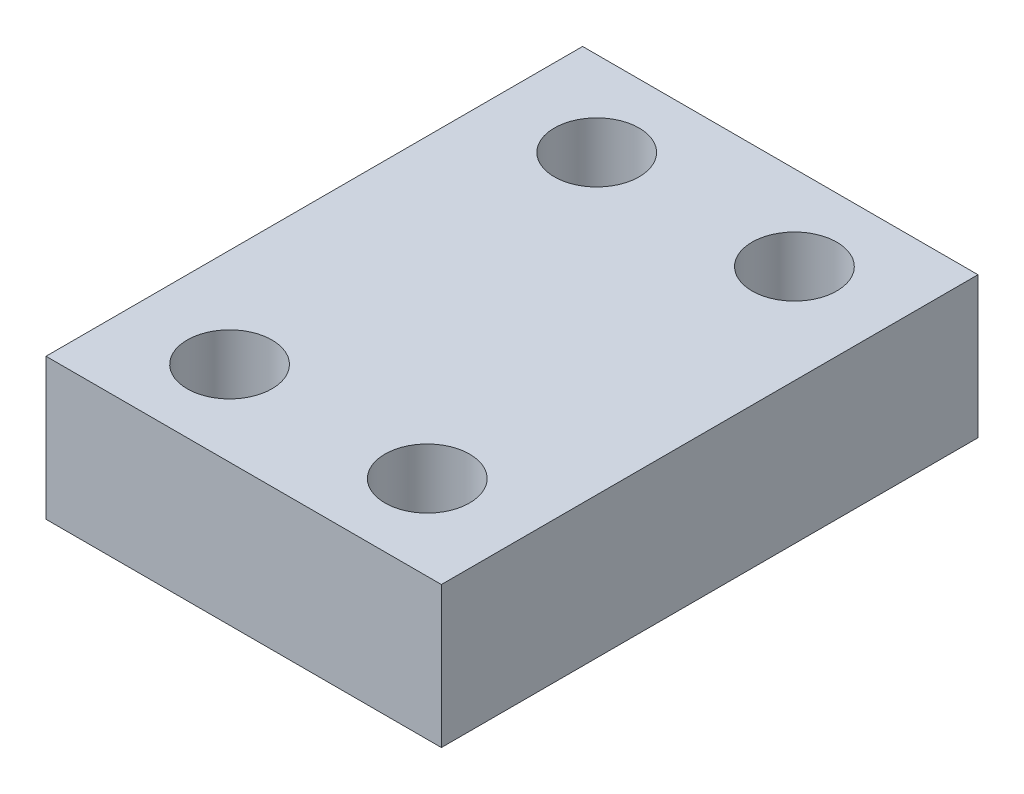
ISO-10303-21;
HEADER;
FILE_DESCRIPTION(('STEP AP214'),'2;1');
FILE_NAME('part.step','',(''),(''),'','','');
FILE_SCHEMA(('AUTOMOTIVE_DESIGN { 1 0 10303 214 1 1 1 1 }'));
ENDSEC;
DATA;
#1=APPLICATION_CONTEXT('core data for automotive mechanical design processes');
#2=APPLICATION_PROTOCOL_DEFINITION('international standard','automotive_design',2000,#1);
#3=PRODUCT_CONTEXT('',#1,'mechanical');
#4=PRODUCT('Part','Part','',(#3));
#5=PRODUCT_RELATED_PRODUCT_CATEGORY('part','',(#4));
#6=PRODUCT_DEFINITION_FORMATION('','',#4);
#7=PRODUCT_DEFINITION_CONTEXT('part definition',#1,'design');
#8=PRODUCT_DEFINITION('design','',#6,#7);
#9=PRODUCT_DEFINITION_SHAPE('','',#8);
#10=(LENGTH_UNIT() NAMED_UNIT(*) SI_UNIT(.MILLI.,.METRE.));
#11=(NAMED_UNIT(*) PLANE_ANGLE_UNIT() SI_UNIT($,.RADIAN.));
#12=(NAMED_UNIT(*) SI_UNIT($,.STERADIAN.) SOLID_ANGLE_UNIT());
#13=UNCERTAINTY_MEASURE_WITH_UNIT(LENGTH_MEASURE(1.E-05),#10,'distance_accuracy_value','');
#14=(GEOMETRIC_REPRESENTATION_CONTEXT(3) GLOBAL_UNCERTAINTY_ASSIGNED_CONTEXT((#13)) GLOBAL_UNIT_ASSIGNED_CONTEXT((#10,
#11,#12)) REPRESENTATION_CONTEXT('',''));
#15=CARTESIAN_POINT('',(0.,0.,0.));
#16=DIRECTION('',(0.,0.,1.));
#17=DIRECTION('',(1.,0.,0.));
#18=AXIS2_PLACEMENT_3D('',#15,#16,#17);
#19=CARTESIAN_POINT('',(0.,5.,0.));
#20=DIRECTION('',(0.,1.,0.));
#21=DIRECTION('',(0.,0.,1.));
#22=AXIS2_PLACEMENT_3D('',#19,#20,#21);
#23=PLANE('',#22);
#24=CARTESIAN_POINT('',(-3.5,5.,6.5));
#25=DIRECTION('',(0.,1.,0.));
#26=DIRECTION('',(0.,0.,1.));
#27=AXIS2_PLACEMENT_3D('',#24,#25,#26);
#28=CIRCLE('',#27,1.5);
#29=CARTESIAN_POINT('',(-3.5,5.,8.));
#30=VERTEX_POINT('',#29);
#31=EDGE_CURVE('E123',#30,#30,#28,.T.);
#32=ORIENTED_EDGE('',*,*,#31,.F.);
#33=EDGE_LOOP('',(#32));
#34=FACE_BOUND('',#33,.T.);
#35=CARTESIAN_POINT('',(3.5,5.,-6.5));
#36=DIRECTION('',(0.,1.,0.));
#37=DIRECTION('',(0.,0.,1.));
#38=AXIS2_PLACEMENT_3D('',#35,#36,#37);
#39=CIRCLE('',#38,1.5);
#40=CARTESIAN_POINT('',(3.5,5.,-5.));
#41=VERTEX_POINT('',#40);
#42=EDGE_CURVE('E102',#41,#41,#39,.T.);
#43=ORIENTED_EDGE('',*,*,#42,.F.);
#44=EDGE_LOOP('',(#43));
#45=FACE_BOUND('',#44,.T.);
#46=DIRECTION('',(0.,0.,-1.));
#47=VECTOR('',#46,1.);
#48=CARTESIAN_POINT('',(7.,5.,-9.5));
#49=LINE('',#48,#47);
#50=CARTESIAN_POINT('',(7.,5.,9.5));
#51=VERTEX_POINT('',#50);
#52=CARTESIAN_POINT('',(7.,5.,-9.5));
#53=VERTEX_POINT('',#52);
#54=EDGE_CURVE('E87',#51,#53,#49,.T.);
#55=ORIENTED_EDGE('',*,*,#54,.T.);
#56=DIRECTION('',(-1.,0.,0.));
#57=VECTOR('',#56,1.);
#58=CARTESIAN_POINT('',(-7.,5.,-9.5));
#59=LINE('',#58,#57);
#60=CARTESIAN_POINT('',(-7.,5.,-9.5));
#61=VERTEX_POINT('',#60);
#62=EDGE_CURVE('E82',#53,#61,#59,.T.);
#63=ORIENTED_EDGE('',*,*,#62,.T.);
#64=DIRECTION('',(0.,0.,1.));
#65=VECTOR('',#64,1.);
#66=CARTESIAN_POINT('',(-7.,5.,-9.5));
#67=LINE('',#66,#65);
#68=CARTESIAN_POINT('',(-7.,5.,9.5));
#69=VERTEX_POINT('',#68);
#70=EDGE_CURVE('E85',#61,#69,#67,.T.);
#71=ORIENTED_EDGE('',*,*,#70,.T.);
#72=DIRECTION('',(1.,0.,0.));
#73=VECTOR('',#72,1.);
#74=CARTESIAN_POINT('',(-7.,5.,9.5));
#75=LINE('',#74,#73);
#76=EDGE_CURVE('E52',#69,#51,#75,.T.);
#77=ORIENTED_EDGE('',*,*,#76,.T.);
#78=EDGE_LOOP('',(#55,#63,#71,#77));
#79=FACE_BOUND('',#78,.T.);
#80=CARTESIAN_POINT('',(-3.5,5.,-6.5));
#81=DIRECTION('',(0.,1.,0.));
#82=DIRECTION('',(0.,0.,-1.));
#83=AXIS2_PLACEMENT_3D('',#80,#81,#82);
#84=CIRCLE('',#83,1.5);
#85=CARTESIAN_POINT('',(-3.5,5.,-8.));
#86=VERTEX_POINT('',#85);
#87=EDGE_CURVE('E117',#86,#86,#84,.T.);
#88=ORIENTED_EDGE('',*,*,#87,.F.);
#89=EDGE_LOOP('',(#88));
#90=FACE_BOUND('',#89,.T.);
#91=CARTESIAN_POINT('',(3.5,5.,6.5));
#92=DIRECTION('',(0.,1.,0.));
#93=DIRECTION('',(0.,0.,-1.));
#94=AXIS2_PLACEMENT_3D('',#91,#92,#93);
#95=CIRCLE('',#94,1.5);
#96=CARTESIAN_POINT('',(3.5,5.,5.));
#97=VERTEX_POINT('',#96);
#98=EDGE_CURVE('E129',#97,#97,#95,.T.);
#99=ORIENTED_EDGE('',*,*,#98,.F.);
#100=EDGE_LOOP('',(#99));
#101=FACE_BOUND('',#100,.T.);
#102=ADVANCED_FACE('F35',(#34,#45,#79,#90,#101),#23,.T.);
#103=CARTESIAN_POINT('',(0.,0.,0.));
#104=DIRECTION('',(0.,1.,0.));
#105=DIRECTION('',(0.,0.,1.));
#106=AXIS2_PLACEMENT_3D('',#103,#104,#105);
#107=PLANE('',#106);
#108=DIRECTION('',(0.,0.,-1.));
#109=VECTOR('',#108,1.);
#110=CARTESIAN_POINT('',(7.,0.,-9.5));
#111=LINE('',#110,#109);
#112=CARTESIAN_POINT('',(7.,0.,9.5));
#113=VERTEX_POINT('',#112);
#114=CARTESIAN_POINT('',(7.,0.,-9.5));
#115=VERTEX_POINT('',#114);
#116=EDGE_CURVE('E99',#113,#115,#111,.T.);
#117=ORIENTED_EDGE('',*,*,#116,.F.);
#118=DIRECTION('',(1.,0.,0.));
#119=VECTOR('',#118,1.);
#120=CARTESIAN_POINT('',(-7.,0.,9.5));
#121=LINE('',#120,#119);
#122=CARTESIAN_POINT('',(-7.,0.,9.5));
#123=VERTEX_POINT('',#122);
#124=EDGE_CURVE('E75',#123,#113,#121,.T.);
#125=ORIENTED_EDGE('',*,*,#124,.F.);
#126=DIRECTION('',(0.,0.,1.));
#127=VECTOR('',#126,1.);
#128=CARTESIAN_POINT('',(-7.,0.,-9.5));
#129=LINE('',#128,#127);
#130=CARTESIAN_POINT('',(-7.,0.,-9.5));
#131=VERTEX_POINT('',#130);
#132=EDGE_CURVE('E69',#131,#123,#129,.T.);
#133=ORIENTED_EDGE('',*,*,#132,.F.);
#134=DIRECTION('',(-1.,0.,0.));
#135=VECTOR('',#134,1.);
#136=CARTESIAN_POINT('',(-7.,0.,-9.5));
#137=LINE('',#136,#135);
#138=EDGE_CURVE('E91',#115,#131,#137,.T.);
#139=ORIENTED_EDGE('',*,*,#138,.F.);
#140=EDGE_LOOP('',(#117,#125,#133,#139));
#141=FACE_BOUND('',#140,.T.);
#142=CARTESIAN_POINT('',(3.5,0.,-6.5));
#143=DIRECTION('',(0.,1.,0.));
#144=DIRECTION('',(0.,0.,1.));
#145=AXIS2_PLACEMENT_3D('',#142,#143,#144);
#146=CIRCLE('',#145,1.5);
#147=CARTESIAN_POINT('',(3.5,0.,-5.));
#148=VERTEX_POINT('',#147);
#149=EDGE_CURVE('E114',#148,#148,#146,.T.);
#150=ORIENTED_EDGE('',*,*,#149,.T.);
#151=EDGE_LOOP('',(#150));
#152=FACE_BOUND('',#151,.T.);
#153=CARTESIAN_POINT('',(-3.5,0.,-6.5));
#154=DIRECTION('',(0.,1.,0.));
#155=DIRECTION('',(0.,0.,-1.));
#156=AXIS2_PLACEMENT_3D('',#153,#154,#155);
#157=CIRCLE('',#156,1.5);
#158=CARTESIAN_POINT('',(-3.5,0.,-8.));
#159=VERTEX_POINT('',#158);
#160=EDGE_CURVE('E120',#159,#159,#157,.T.);
#161=ORIENTED_EDGE('',*,*,#160,.T.);
#162=EDGE_LOOP('',(#161));
#163=FACE_BOUND('',#162,.T.);
#164=CARTESIAN_POINT('',(-3.5,0.,6.5));
#165=DIRECTION('',(0.,1.,0.));
#166=DIRECTION('',(0.,0.,1.));
#167=AXIS2_PLACEMENT_3D('',#164,#165,#166);
#168=CIRCLE('',#167,1.5);
#169=CARTESIAN_POINT('',(-3.5,0.,8.));
#170=VERTEX_POINT('',#169);
#171=EDGE_CURVE('E126',#170,#170,#168,.T.);
#172=ORIENTED_EDGE('',*,*,#171,.T.);
#173=EDGE_LOOP('',(#172));
#174=FACE_BOUND('',#173,.T.);
#175=CARTESIAN_POINT('',(3.5,0.,6.5));
#176=DIRECTION('',(0.,1.,0.));
#177=DIRECTION('',(0.,0.,-1.));
#178=AXIS2_PLACEMENT_3D('',#175,#176,#177);
#179=CIRCLE('',#178,1.5);
#180=CARTESIAN_POINT('',(3.5,0.,5.));
#181=VERTEX_POINT('',#180);
#182=EDGE_CURVE('E132',#181,#181,#179,.T.);
#183=ORIENTED_EDGE('',*,*,#182,.T.);
#184=EDGE_LOOP('',(#183));
#185=FACE_BOUND('',#184,.T.);
#186=ADVANCED_FACE('F110',(#141,#152,#163,#174,#185),#107,.F.);
#187=CARTESIAN_POINT('',(7.,5.,-9.5));
#188=DIRECTION('',(-1.,0.,0.));
#189=DIRECTION('',(0.,0.,1.));
#190=AXIS2_PLACEMENT_3D('',#187,#188,#189);
#191=PLANE('',#190);
#192=ORIENTED_EDGE('',*,*,#116,.T.);
#193=DIRECTION('',(0.,-1.,0.));
#194=VECTOR('',#193,1.);
#195=CARTESIAN_POINT('',(7.,5.,-9.5));
#196=LINE('',#195,#194);
#197=EDGE_CURVE('E11',#53,#115,#196,.T.);
#198=ORIENTED_EDGE('',*,*,#197,.F.);
#199=ORIENTED_EDGE('',*,*,#54,.F.);
#200=DIRECTION('',(0.,-1.,0.));
#201=VECTOR('',#200,1.);
#202=CARTESIAN_POINT('',(7.,5.,9.5));
#203=LINE('',#202,#201);
#204=EDGE_CURVE('E95',#51,#113,#203,.T.);
#205=ORIENTED_EDGE('',*,*,#204,.T.);
#206=EDGE_LOOP('',(#192,#198,#199,#205));
#207=FACE_BOUND('',#206,.T.);
#208=ADVANCED_FACE('F37',(#207),#191,.F.);
#209=CARTESIAN_POINT('',(-7.,5.,-9.5));
#210=DIRECTION('',(0.,0.,1.));
#211=DIRECTION('',(1.,0.,0.));
#212=AXIS2_PLACEMENT_3D('',#209,#210,#211);
#213=PLANE('',#212);
#214=ORIENTED_EDGE('',*,*,#138,.T.);
#215=DIRECTION('',(0.,-1.,0.));
#216=VECTOR('',#215,1.);
#217=CARTESIAN_POINT('',(-7.,5.,-9.5));
#218=LINE('',#217,#216);
#219=EDGE_CURVE('E44',#61,#131,#218,.T.);
#220=ORIENTED_EDGE('',*,*,#219,.F.);
#221=ORIENTED_EDGE('',*,*,#62,.F.);
#222=ORIENTED_EDGE('',*,*,#197,.T.);
#223=EDGE_LOOP('',(#214,#220,#221,#222));
#224=FACE_BOUND('',#223,.T.);
#225=ADVANCED_FACE('F90',(#224),#213,.F.);
#226=CARTESIAN_POINT('',(-7.,5.,-9.5));
#227=DIRECTION('',(1.,0.,0.));
#228=DIRECTION('',(0.,0.,-1.));
#229=AXIS2_PLACEMENT_3D('',#226,#227,#228);
#230=PLANE('',#229);
#231=ORIENTED_EDGE('',*,*,#132,.T.);
#232=DIRECTION('',(0.,-1.,0.));
#233=VECTOR('',#232,1.);
#234=CARTESIAN_POINT('',(-7.,5.,9.5));
#235=LINE('',#234,#233);
#236=EDGE_CURVE('E92',#69,#123,#235,.T.);
#237=ORIENTED_EDGE('',*,*,#236,.F.);
#238=ORIENTED_EDGE('',*,*,#70,.F.);
#239=ORIENTED_EDGE('',*,*,#219,.T.);
#240=EDGE_LOOP('',(#231,#237,#238,#239));
#241=FACE_BOUND('',#240,.T.);
#242=ADVANCED_FACE('F93',(#241),#230,.F.);
#243=CARTESIAN_POINT('',(-7.,5.,9.5));
#244=DIRECTION('',(0.,0.,-1.));
#245=DIRECTION('',(-1.,0.,0.));
#246=AXIS2_PLACEMENT_3D('',#243,#244,#245);
#247=PLANE('',#246);
#248=ORIENTED_EDGE('',*,*,#124,.T.);
#249=ORIENTED_EDGE('',*,*,#204,.F.);
#250=ORIENTED_EDGE('',*,*,#76,.F.);
#251=ORIENTED_EDGE('',*,*,#236,.T.);
#252=EDGE_LOOP('',(#248,#249,#250,#251));
#253=FACE_BOUND('',#252,.T.);
#254=ADVANCED_FACE('F107',(#253),#247,.F.);
#255=CARTESIAN_POINT('',(3.5,5.,-6.5));
#256=DIRECTION('',(0.,-1.,0.));
#257=DIRECTION('',(0.,0.,-1.));
#258=AXIS2_PLACEMENT_3D('',#255,#256,#257);
#259=CYLINDRICAL_SURFACE('',#258,1.5);
#260=ORIENTED_EDGE('',*,*,#42,.T.);
#261=EDGE_LOOP('',(#260));
#262=FACE_BOUND('',#261,.T.);
#263=ORIENTED_EDGE('',*,*,#149,.F.);
#264=EDGE_LOOP('',(#263));
#265=FACE_BOUND('',#264,.T.);
#266=ADVANCED_FACE('F151',(#262,#265),#259,.F.);
#267=CARTESIAN_POINT('',(-3.5,5.,-6.5));
#268=DIRECTION('',(0.,-1.,0.));
#269=DIRECTION('',(0.,0.,-1.));
#270=AXIS2_PLACEMENT_3D('',#267,#268,#269);
#271=CYLINDRICAL_SURFACE('',#270,1.5);
#272=ORIENTED_EDGE('',*,*,#87,.T.);
#273=EDGE_LOOP('',(#272));
#274=FACE_BOUND('',#273,.T.);
#275=ORIENTED_EDGE('',*,*,#160,.F.);
#276=EDGE_LOOP('',(#275));
#277=FACE_BOUND('',#276,.T.);
#278=ADVANCED_FACE('F197',(#274,#277),#271,.F.);
#279=CARTESIAN_POINT('',(-3.5,5.,6.5));
#280=DIRECTION('',(0.,-1.,0.));
#281=DIRECTION('',(0.,0.,-1.));
#282=AXIS2_PLACEMENT_3D('',#279,#280,#281);
#283=CYLINDRICAL_SURFACE('',#282,1.5);
#284=ORIENTED_EDGE('',*,*,#31,.T.);
#285=EDGE_LOOP('',(#284));
#286=FACE_BOUND('',#285,.T.);
#287=ORIENTED_EDGE('',*,*,#171,.F.);
#288=EDGE_LOOP('',(#287));
#289=FACE_BOUND('',#288,.T.);
#290=ADVANCED_FACE('F205',(#286,#289),#283,.F.);
#291=CARTESIAN_POINT('',(3.5,5.,6.5));
#292=DIRECTION('',(0.,-1.,0.));
#293=DIRECTION('',(0.,0.,-1.));
#294=AXIS2_PLACEMENT_3D('',#291,#292,#293);
#295=CYLINDRICAL_SURFACE('',#294,1.5);
#296=ORIENTED_EDGE('',*,*,#98,.T.);
#297=EDGE_LOOP('',(#296));
#298=FACE_BOUND('',#297,.T.);
#299=ORIENTED_EDGE('',*,*,#182,.F.);
#300=EDGE_LOOP('',(#299));
#301=FACE_BOUND('',#300,.T.);
#302=ADVANCED_FACE('F138',(#298,#301),#295,.F.);
#303=CLOSED_SHELL('',(#102,#186,#208,#225,#242,#254,#266,#278,#290,#302));
#304=MANIFOLD_SOLID_BREP('B2',#303);
#305=ADVANCED_BREP_SHAPE_REPRESENTATION('',(#18,#304),#14);
#306=SHAPE_DEFINITION_REPRESENTATION(#9,#305);
ENDSEC;
END-ISO-10303-21;
